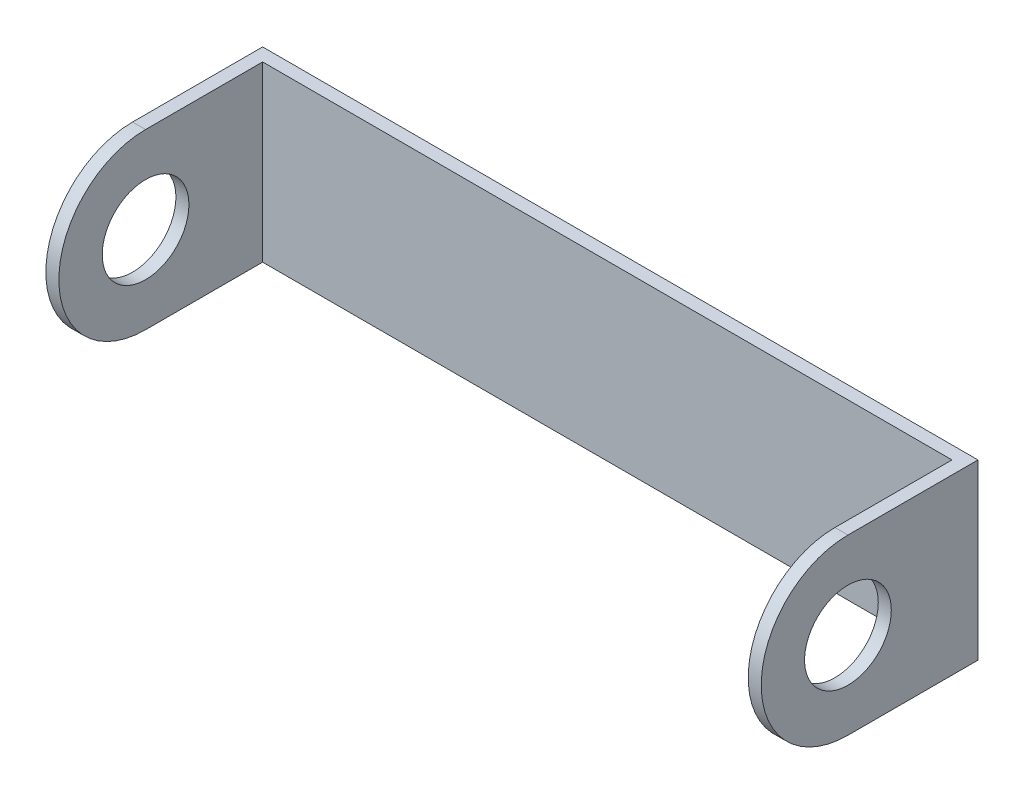
ISO-10303-21;
HEADER;
FILE_DESCRIPTION(('STEP AP214'),'2;1');
FILE_NAME('part.step','',(''),(''),'','','');
FILE_SCHEMA(('AUTOMOTIVE_DESIGN { 1 0 10303 214 1 1 1 1 }'));
ENDSEC;
DATA;
#1=APPLICATION_CONTEXT('core data for automotive mechanical design processes');
#2=APPLICATION_PROTOCOL_DEFINITION('international standard','automotive_design',2000,#1);
#3=PRODUCT_CONTEXT('',#1,'mechanical');
#4=PRODUCT('Part','Part','',(#3));
#5=PRODUCT_RELATED_PRODUCT_CATEGORY('part','',(#4));
#6=PRODUCT_DEFINITION_FORMATION('','',#4);
#7=PRODUCT_DEFINITION_CONTEXT('part definition',#1,'design');
#8=PRODUCT_DEFINITION('design','',#6,#7);
#9=PRODUCT_DEFINITION_SHAPE('','',#8);
#10=(LENGTH_UNIT() NAMED_UNIT(*) SI_UNIT(.MILLI.,.METRE.));
#11=(NAMED_UNIT(*) PLANE_ANGLE_UNIT() SI_UNIT($,.RADIAN.));
#12=(NAMED_UNIT(*) SI_UNIT($,.STERADIAN.) SOLID_ANGLE_UNIT());
#13=UNCERTAINTY_MEASURE_WITH_UNIT(LENGTH_MEASURE(1.E-05),#10,'distance_accuracy_value','');
#14=(GEOMETRIC_REPRESENTATION_CONTEXT(3) GLOBAL_UNCERTAINTY_ASSIGNED_CONTEXT((#13)) GLOBAL_UNIT_ASSIGNED_CONTEXT((#10,
#11,#12)) REPRESENTATION_CONTEXT('',''));
#15=CARTESIAN_POINT('',(0.,0.,0.));
#16=DIRECTION('',(0.,0.,1.));
#17=DIRECTION('',(1.,0.,0.));
#18=AXIS2_PLACEMENT_3D('',#15,#16,#17);
#19=CARTESIAN_POINT('',(79.5,-20.,3.));
#20=DIRECTION('',(0.,1.,0.));
#21=DIRECTION('',(0.,0.,1.));
#22=AXIS2_PLACEMENT_3D('',#19,#20,#21);
#23=PLANE('',#22);
#24=DIRECTION('',(-1.,0.,0.));
#25=VECTOR('',#24,1.);
#26=CARTESIAN_POINT('',(79.5,-20.,3.));
#27=LINE('',#26,#25);
#28=CARTESIAN_POINT('',(79.5,-20.,3.));
#29=VERTEX_POINT('',#28);
#30=CARTESIAN_POINT('',(-79.5,-20.,3.));
#31=VERTEX_POINT('',#30);
#32=EDGE_CURVE('E163',#29,#31,#27,.T.);
#33=ORIENTED_EDGE('',*,*,#32,.T.);
#34=DIRECTION('',(0.,0.,-1.));
#35=VECTOR('',#34,1.);
#36=CARTESIAN_POINT('',(-79.5,-20.,0.));
#37=LINE('',#36,#35);
#38=CARTESIAN_POINT('',(-79.5,-20.,30.));
#39=VERTEX_POINT('',#38);
#40=EDGE_CURVE('E123',#39,#31,#37,.T.);
#41=ORIENTED_EDGE('',*,*,#40,.F.);
#42=DIRECTION('',(1.,0.,0.));
#43=VECTOR('',#42,1.);
#44=CARTESIAN_POINT('',(-82.5,-20.,30.));
#45=LINE('',#44,#43);
#46=CARTESIAN_POINT('',(-82.5,-20.,30.));
#47=VERTEX_POINT('',#46);
#48=EDGE_CURVE('E115',#47,#39,#45,.T.);
#49=ORIENTED_EDGE('',*,*,#48,.F.);
#50=DIRECTION('',(0.,0.,-1.));
#51=VECTOR('',#50,1.);
#52=CARTESIAN_POINT('',(-82.5,-20.,0.));
#53=LINE('',#52,#51);
#54=CARTESIAN_POINT('',(-82.5,-20.,0.));
#55=VERTEX_POINT('',#54);
#56=EDGE_CURVE('E107',#47,#55,#53,.T.);
#57=ORIENTED_EDGE('',*,*,#56,.T.);
#58=DIRECTION('',(-1.,0.,0.));
#59=VECTOR('',#58,1.);
#60=CARTESIAN_POINT('',(79.5,-20.,0.));
#61=LINE('',#60,#59);
#62=CARTESIAN_POINT('',(82.5,-20.,0.));
#63=VERTEX_POINT('',#62);
#64=EDGE_CURVE('E11',#63,#55,#61,.T.);
#65=ORIENTED_EDGE('',*,*,#64,.F.);
#66=DIRECTION('',(0.,0.,-1.));
#67=VECTOR('',#66,1.);
#68=CARTESIAN_POINT('',(82.5,-20.,0.));
#69=LINE('',#68,#67);
#70=CARTESIAN_POINT('',(82.5,-20.,30.));
#71=VERTEX_POINT('',#70);
#72=EDGE_CURVE('E146',#71,#63,#69,.T.);
#73=ORIENTED_EDGE('',*,*,#72,.F.);
#74=DIRECTION('',(-1.,0.,0.));
#75=VECTOR('',#74,1.);
#76=CARTESIAN_POINT('',(82.5,-20.,30.));
#77=LINE('',#76,#75);
#78=CARTESIAN_POINT('',(79.5,-20.,30.));
#79=VERTEX_POINT('',#78);
#80=EDGE_CURVE('E148',#71,#79,#77,.T.);
#81=ORIENTED_EDGE('',*,*,#80,.T.);
#82=DIRECTION('',(0.,0.,-1.));
#83=VECTOR('',#82,1.);
#84=CARTESIAN_POINT('',(79.5,-20.,0.));
#85=LINE('',#84,#83);
#86=EDGE_CURVE('E142',#79,#29,#85,.T.);
#87=ORIENTED_EDGE('',*,*,#86,.T.);
#88=EDGE_LOOP('',(#33,#41,#49,#57,#65,#73,#81,#87));
#89=FACE_BOUND('',#88,.T.);
#90=ADVANCED_FACE('F33',(#89),#23,.F.);
#91=CARTESIAN_POINT('',(79.5,-20.,0.));
#92=DIRECTION('',(0.,0.,1.));
#93=DIRECTION('',(1.,0.,0.));
#94=AXIS2_PLACEMENT_3D('',#91,#92,#93);
#95=PLANE('',#94);
#96=ORIENTED_EDGE('',*,*,#64,.T.);
#97=DIRECTION('',(0.,1.,0.));
#98=VECTOR('',#97,1.);
#99=CARTESIAN_POINT('',(-82.5,20.,0.));
#100=LINE('',#99,#98);
#101=CARTESIAN_POINT('',(-82.5,20.,0.));
#102=VERTEX_POINT('',#101);
#103=EDGE_CURVE('E95',#55,#102,#100,.T.);
#104=ORIENTED_EDGE('',*,*,#103,.T.);
#105=DIRECTION('',(-1.,0.,0.));
#106=VECTOR('',#105,1.);
#107=CARTESIAN_POINT('',(79.5,20.,0.));
#108=LINE('',#107,#106);
#109=CARTESIAN_POINT('',(82.5,20.,0.));
#110=VERTEX_POINT('',#109);
#111=EDGE_CURVE('E41',#110,#102,#108,.T.);
#112=ORIENTED_EDGE('',*,*,#111,.F.);
#113=DIRECTION('',(0.,1.,0.));
#114=VECTOR('',#113,1.);
#115=CARTESIAN_POINT('',(82.5,20.,0.));
#116=LINE('',#115,#114);
#117=EDGE_CURVE('E98',#63,#110,#116,.T.);
#118=ORIENTED_EDGE('',*,*,#117,.F.);
#119=EDGE_LOOP('',(#96,#104,#112,#118));
#120=FACE_BOUND('',#119,.T.);
#121=ADVANCED_FACE('F94',(#120),#95,.F.);
#122=CARTESIAN_POINT('',(79.5,20.,0.));
#123=DIRECTION('',(0.,-1.,0.));
#124=DIRECTION('',(0.,0.,-1.));
#125=AXIS2_PLACEMENT_3D('',#122,#123,#124);
#126=PLANE('',#125);
#127=ORIENTED_EDGE('',*,*,#111,.T.);
#128=DIRECTION('',(0.,0.,1.));
#129=VECTOR('',#128,1.);
#130=CARTESIAN_POINT('',(-82.5,20.,0.));
#131=LINE('',#130,#129);
#132=CARTESIAN_POINT('',(-82.5,20.,30.));
#133=VERTEX_POINT('',#132);
#134=EDGE_CURVE('E110',#102,#133,#131,.T.);
#135=ORIENTED_EDGE('',*,*,#134,.T.);
#136=DIRECTION('',(1.,0.,0.));
#137=VECTOR('',#136,1.);
#138=CARTESIAN_POINT('',(-82.5,20.,30.));
#139=LINE('',#138,#137);
#140=CARTESIAN_POINT('',(-79.5,20.,30.));
#141=VERTEX_POINT('',#140);
#142=EDGE_CURVE('E122',#133,#141,#139,.T.);
#143=ORIENTED_EDGE('',*,*,#142,.T.);
#144=DIRECTION('',(0.,0.,1.));
#145=VECTOR('',#144,1.);
#146=CARTESIAN_POINT('',(-79.5,20.,0.));
#147=LINE('',#146,#145);
#148=CARTESIAN_POINT('',(-79.5,20.,3.));
#149=VERTEX_POINT('',#148);
#150=EDGE_CURVE('E111',#149,#141,#147,.T.);
#151=ORIENTED_EDGE('',*,*,#150,.F.);
#152=DIRECTION('',(-1.,0.,0.));
#153=VECTOR('',#152,1.);
#154=CARTESIAN_POINT('',(79.5,20.,3.));
#155=LINE('',#154,#153);
#156=CARTESIAN_POINT('',(79.5,20.,3.));
#157=VERTEX_POINT('',#156);
#158=EDGE_CURVE('E47',#157,#149,#155,.T.);
#159=ORIENTED_EDGE('',*,*,#158,.F.);
#160=DIRECTION('',(0.,0.,1.));
#161=VECTOR('',#160,1.);
#162=CARTESIAN_POINT('',(79.5,20.,0.));
#163=LINE('',#162,#161);
#164=CARTESIAN_POINT('',(79.5,20.,30.));
#165=VERTEX_POINT('',#164);
#166=EDGE_CURVE('E137',#157,#165,#163,.T.);
#167=ORIENTED_EDGE('',*,*,#166,.T.);
#168=DIRECTION('',(-1.,0.,0.));
#169=VECTOR('',#168,1.);
#170=CARTESIAN_POINT('',(82.5,20.,30.));
#171=LINE('',#170,#169);
#172=CARTESIAN_POINT('',(82.5,20.,30.));
#173=VERTEX_POINT('',#172);
#174=EDGE_CURVE('E156',#173,#165,#171,.T.);
#175=ORIENTED_EDGE('',*,*,#174,.F.);
#176=DIRECTION('',(0.,0.,1.));
#177=VECTOR('',#176,1.);
#178=CARTESIAN_POINT('',(82.5,20.,0.));
#179=LINE('',#178,#177);
#180=EDGE_CURVE('E141',#110,#173,#179,.T.);
#181=ORIENTED_EDGE('',*,*,#180,.F.);
#182=EDGE_LOOP('',(#127,#135,#143,#151,#159,#167,#175,#181));
#183=FACE_BOUND('',#182,.T.);
#184=ADVANCED_FACE('F168',(#183),#126,.F.);
#185=CARTESIAN_POINT('',(79.5,20.,3.));
#186=DIRECTION('',(0.,0.,-1.));
#187=DIRECTION('',(-1.,0.,0.));
#188=AXIS2_PLACEMENT_3D('',#185,#186,#187);
#189=PLANE('',#188);
#190=DIRECTION('',(0.,-1.,0.));
#191=VECTOR('',#190,1.);
#192=CARTESIAN_POINT('',(-79.5,20.,3.));
#193=LINE('',#192,#191);
#194=EDGE_CURVE('E159',#149,#31,#193,.T.);
#195=ORIENTED_EDGE('',*,*,#194,.T.);
#196=ORIENTED_EDGE('',*,*,#32,.F.);
#197=DIRECTION('',(0.,-1.,0.));
#198=VECTOR('',#197,1.);
#199=CARTESIAN_POINT('',(79.5,20.,3.));
#200=LINE('',#199,#198);
#201=EDGE_CURVE('E160',#157,#29,#200,.T.);
#202=ORIENTED_EDGE('',*,*,#201,.F.);
#203=ORIENTED_EDGE('',*,*,#158,.T.);
#204=EDGE_LOOP('',(#195,#196,#202,#203));
#205=FACE_BOUND('',#204,.T.);
#206=ADVANCED_FACE('F182',(#205),#189,.F.);
#207=CARTESIAN_POINT('',(79.5,0.,30.));
#208=DIRECTION('',(1.,0.,0.));
#209=DIRECTION('',(0.,0.,-1.));
#210=AXIS2_PLACEMENT_3D('',#207,#208,#209);
#211=PLANE('',#210);
#212=CARTESIAN_POINT('',(79.5,0.,30.));
#213=DIRECTION('',(1.,0.,0.));
#214=DIRECTION('',(0.,0.,-1.));
#215=AXIS2_PLACEMENT_3D('',#212,#213,#214);
#216=CIRCLE('',#215,10.);
#217=CARTESIAN_POINT('',(79.5,0.,20.));
#218=VERTEX_POINT('',#217);
#219=EDGE_CURVE('E133',#218,#218,#216,.T.);
#220=ORIENTED_EDGE('',*,*,#219,.T.);
#221=EDGE_LOOP('',(#220));
#222=FACE_BOUND('',#221,.T.);
#223=ORIENTED_EDGE('',*,*,#166,.F.);
#224=ORIENTED_EDGE('',*,*,#201,.T.);
#225=ORIENTED_EDGE('',*,*,#86,.F.);
#226=CARTESIAN_POINT('',(79.5,0.,30.));
#227=DIRECTION('',(1.,0.,0.));
#228=DIRECTION('',(0.,0.,-1.));
#229=AXIS2_PLACEMENT_3D('',#226,#227,#228);
#230=CIRCLE('',#229,20.);
#231=EDGE_CURVE('E150',#165,#79,#230,.T.);
#232=ORIENTED_EDGE('',*,*,#231,.F.);
#233=EDGE_LOOP('',(#223,#224,#225,#232));
#234=FACE_BOUND('',#233,.T.);
#235=ADVANCED_FACE('F180',(#222,#234),#211,.F.);
#236=CARTESIAN_POINT('',(82.5,0.,30.));
#237=DIRECTION('',(1.,0.,0.));
#238=DIRECTION('',(0.,0.,-1.));
#239=AXIS2_PLACEMENT_3D('',#236,#237,#238);
#240=PLANE('',#239);
#241=ORIENTED_EDGE('',*,*,#117,.T.);
#242=ORIENTED_EDGE('',*,*,#180,.T.);
#243=CARTESIAN_POINT('',(82.5,0.,30.));
#244=DIRECTION('',(1.,0.,0.));
#245=DIRECTION('',(0.,0.,-1.));
#246=AXIS2_PLACEMENT_3D('',#243,#244,#245);
#247=CIRCLE('',#246,20.);
#248=EDGE_CURVE('E144',#173,#71,#247,.T.);
#249=ORIENTED_EDGE('',*,*,#248,.T.);
#250=ORIENTED_EDGE('',*,*,#72,.T.);
#251=EDGE_LOOP('',(#241,#242,#249,#250));
#252=FACE_BOUND('',#251,.T.);
#253=CARTESIAN_POINT('',(82.5,0.,30.));
#254=DIRECTION('',(1.,0.,0.));
#255=DIRECTION('',(0.,0.,-1.));
#256=AXIS2_PLACEMENT_3D('',#253,#254,#255);
#257=CIRCLE('',#256,10.);
#258=CARTESIAN_POINT('',(82.5,0.,20.));
#259=VERTEX_POINT('',#258);
#260=EDGE_CURVE('E134',#259,#259,#257,.T.);
#261=ORIENTED_EDGE('',*,*,#260,.F.);
#262=EDGE_LOOP('',(#261));
#263=FACE_BOUND('',#262,.T.);
#264=ADVANCED_FACE('F172',(#252,#263),#240,.T.);
#265=CARTESIAN_POINT('',(82.5,0.,30.));
#266=DIRECTION('',(-1.,0.,0.));
#267=DIRECTION('',(0.,0.,1.));
#268=AXIS2_PLACEMENT_3D('',#265,#266,#267);
#269=CYLINDRICAL_SURFACE('',#268,20.);
#270=ORIENTED_EDGE('',*,*,#231,.T.);
#271=ORIENTED_EDGE('',*,*,#80,.F.);
#272=ORIENTED_EDGE('',*,*,#248,.F.);
#273=ORIENTED_EDGE('',*,*,#174,.T.);
#274=EDGE_LOOP('',(#270,#271,#272,#273));
#275=FACE_BOUND('',#274,.T.);
#276=ADVANCED_FACE('F198',(#275),#269,.T.);
#277=CARTESIAN_POINT('',(82.5,0.,30.));
#278=DIRECTION('',(-1.,0.,0.));
#279=DIRECTION('',(0.,0.,1.));
#280=AXIS2_PLACEMENT_3D('',#277,#278,#279);
#281=CYLINDRICAL_SURFACE('',#280,10.);
#282=ORIENTED_EDGE('',*,*,#260,.T.);
#283=EDGE_LOOP('',(#282));
#284=FACE_BOUND('',#283,.T.);
#285=ORIENTED_EDGE('',*,*,#219,.F.);
#286=EDGE_LOOP('',(#285));
#287=FACE_BOUND('',#286,.T.);
#288=ADVANCED_FACE('F190',(#284,#287),#281,.F.);
#289=CARTESIAN_POINT('',(-82.5,0.,30.));
#290=DIRECTION('',(1.,0.,0.));
#291=DIRECTION('',(0.,0.,-1.));
#292=AXIS2_PLACEMENT_3D('',#289,#290,#291);
#293=CYLINDRICAL_SURFACE('',#292,20.);
#294=CARTESIAN_POINT('',(-79.5,0.,30.));
#295=DIRECTION('',(1.,0.,0.));
#296=DIRECTION('',(0.,0.,-1.));
#297=AXIS2_PLACEMENT_3D('',#294,#295,#296);
#298=CIRCLE('',#297,20.);
#299=EDGE_CURVE('E125',#141,#39,#298,.T.);
#300=ORIENTED_EDGE('',*,*,#299,.F.);
#301=ORIENTED_EDGE('',*,*,#142,.F.);
#302=CARTESIAN_POINT('',(-82.5,0.,30.));
#303=DIRECTION('',(1.,0.,0.));
#304=DIRECTION('',(0.,0.,-1.));
#305=AXIS2_PLACEMENT_3D('',#302,#303,#304);
#306=CIRCLE('',#305,20.);
#307=EDGE_CURVE('E116',#133,#47,#306,.T.);
#308=ORIENTED_EDGE('',*,*,#307,.T.);
#309=ORIENTED_EDGE('',*,*,#48,.T.);
#310=EDGE_LOOP('',(#300,#301,#308,#309));
#311=FACE_BOUND('',#310,.T.);
#312=ADVANCED_FACE('F188',(#311),#293,.T.);
#313=CARTESIAN_POINT('',(-82.5,0.,30.));
#314=DIRECTION('',(-1.,0.,0.));
#315=DIRECTION('',(0.,0.,-1.));
#316=AXIS2_PLACEMENT_3D('',#313,#314,#315);
#317=PLANE('',#316);
#318=CARTESIAN_POINT('',(-82.5,0.,30.));
#319=DIRECTION('',(1.,0.,0.));
#320=DIRECTION('',(0.,0.,-1.));
#321=AXIS2_PLACEMENT_3D('',#318,#319,#320);
#322=CIRCLE('',#321,10.);
#323=CARTESIAN_POINT('',(-82.5,0.,20.));
#324=VERTEX_POINT('',#323);
#325=EDGE_CURVE('E126',#324,#324,#322,.T.);
#326=ORIENTED_EDGE('',*,*,#325,.T.);
#327=EDGE_LOOP('',(#326));
#328=FACE_BOUND('',#327,.T.);
#329=ORIENTED_EDGE('',*,*,#103,.F.);
#330=ORIENTED_EDGE('',*,*,#56,.F.);
#331=ORIENTED_EDGE('',*,*,#307,.F.);
#332=ORIENTED_EDGE('',*,*,#134,.F.);
#333=EDGE_LOOP('',(#329,#330,#331,#332));
#334=FACE_BOUND('',#333,.T.);
#335=ADVANCED_FACE('F105',(#328,#334),#317,.T.);
#336=CARTESIAN_POINT('',(-79.5,0.,30.));
#337=DIRECTION('',(-1.,0.,0.));
#338=DIRECTION('',(0.,0.,-1.));
#339=AXIS2_PLACEMENT_3D('',#336,#337,#338);
#340=PLANE('',#339);
#341=ORIENTED_EDGE('',*,*,#194,.F.);
#342=ORIENTED_EDGE('',*,*,#150,.T.);
#343=ORIENTED_EDGE('',*,*,#299,.T.);
#344=ORIENTED_EDGE('',*,*,#40,.T.);
#345=EDGE_LOOP('',(#341,#342,#343,#344));
#346=FACE_BOUND('',#345,.T.);
#347=CARTESIAN_POINT('',(-79.5,0.,30.));
#348=DIRECTION('',(1.,0.,0.));
#349=DIRECTION('',(0.,0.,-1.));
#350=AXIS2_PLACEMENT_3D('',#347,#348,#349);
#351=CIRCLE('',#350,10.);
#352=CARTESIAN_POINT('',(-79.5,0.,20.));
#353=VERTEX_POINT('',#352);
#354=EDGE_CURVE('E291',#353,#353,#351,.T.);
#355=ORIENTED_EDGE('',*,*,#354,.F.);
#356=EDGE_LOOP('',(#355));
#357=FACE_BOUND('',#356,.T.);
#358=ADVANCED_FACE('F185',(#346,#357),#340,.F.);
#359=CARTESIAN_POINT('',(-82.5,0.,30.));
#360=DIRECTION('',(1.,0.,0.));
#361=DIRECTION('',(0.,0.,-1.));
#362=AXIS2_PLACEMENT_3D('',#359,#360,#361);
#363=CYLINDRICAL_SURFACE('',#362,10.);
#364=ORIENTED_EDGE('',*,*,#325,.F.);
#365=EDGE_LOOP('',(#364));
#366=FACE_BOUND('',#365,.T.);
#367=ORIENTED_EDGE('',*,*,#354,.T.);
#368=EDGE_LOOP('',(#367));
#369=FACE_BOUND('',#368,.T.);
#370=ADVANCED_FACE('F274',(#366,#369),#363,.F.);
#371=CLOSED_SHELL('',(#90,#121,#184,#206,#235,#264,#276,#288,#312,#335,#358,#370));
#372=MANIFOLD_SOLID_BREP('B2',#371);
#373=ADVANCED_BREP_SHAPE_REPRESENTATION('',(#18,#372),#14);
#374=SHAPE_DEFINITION_REPRESENTATION(#9,#373);
ENDSEC;
END-ISO-10303-21;
